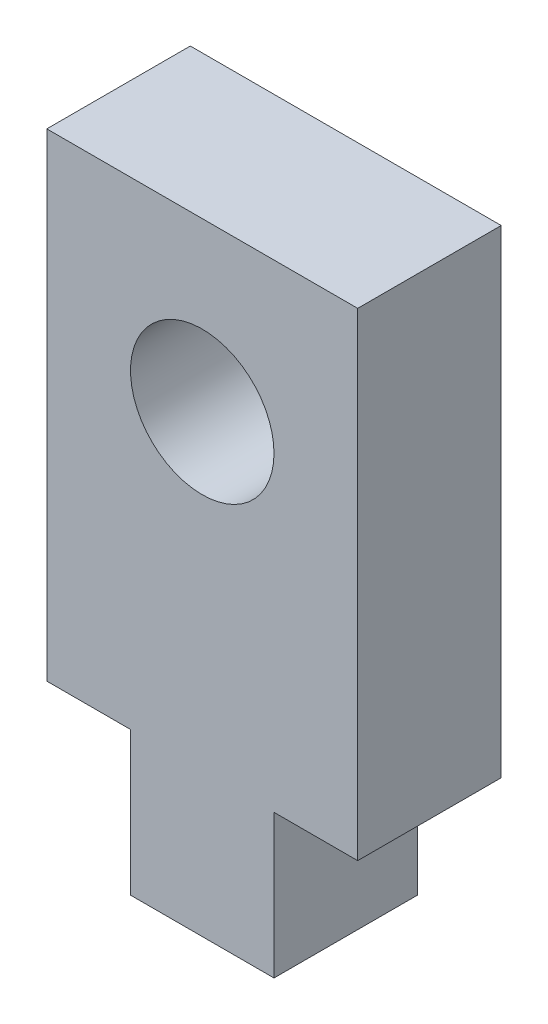
ISO-10303-21;
HEADER;
FILE_DESCRIPTION(('STEP AP214'),'2;1');
FILE_NAME('part.step','',(''),(''),'','','');
FILE_SCHEMA(('AUTOMOTIVE_DESIGN { 1 0 10303 214 1 1 1 1 }'));
ENDSEC;
DATA;
#1=APPLICATION_CONTEXT('core data for automotive mechanical design processes');
#2=APPLICATION_PROTOCOL_DEFINITION('international standard','automotive_design',2000,#1);
#3=PRODUCT_CONTEXT('',#1,'mechanical');
#4=PRODUCT('Part','Part','',(#3));
#5=PRODUCT_RELATED_PRODUCT_CATEGORY('part','',(#4));
#6=PRODUCT_DEFINITION_FORMATION('','',#4);
#7=PRODUCT_DEFINITION_CONTEXT('part definition',#1,'design');
#8=PRODUCT_DEFINITION('design','',#6,#7);
#9=PRODUCT_DEFINITION_SHAPE('','',#8);
#10=(LENGTH_UNIT() NAMED_UNIT(*) SI_UNIT(.MILLI.,.METRE.));
#11=(NAMED_UNIT(*) PLANE_ANGLE_UNIT() SI_UNIT($,.RADIAN.));
#12=(NAMED_UNIT(*) SI_UNIT($,.STERADIAN.) SOLID_ANGLE_UNIT());
#13=UNCERTAINTY_MEASURE_WITH_UNIT(LENGTH_MEASURE(1.E-05),#10,'distance_accuracy_value','');
#14=(GEOMETRIC_REPRESENTATION_CONTEXT(3) GLOBAL_UNCERTAINTY_ASSIGNED_CONTEXT((#13)) GLOBAL_UNIT_ASSIGNED_CONTEXT((#10,
#11,#12)) REPRESENTATION_CONTEXT('',''));
#15=CARTESIAN_POINT('',(0.,0.,0.));
#16=DIRECTION('',(0.,0.,1.));
#17=DIRECTION('',(1.,0.,0.));
#18=AXIS2_PLACEMENT_3D('',#15,#16,#17);
#19=CARTESIAN_POINT('',(0.,0.,3.));
#20=DIRECTION('',(0.,0.,1.));
#21=DIRECTION('',(1.,0.,0.));
#22=AXIS2_PLACEMENT_3D('',#19,#20,#21);
#23=PLANE('',#22);
#24=DIRECTION('',(1.,0.,0.));
#25=VECTOR('',#24,1.);
#26=CARTESIAN_POINT('',(-3.25,-5.,3.));
#27=LINE('',#26,#25);
#28=CARTESIAN_POINT('',(-3.25,-5.,3.));
#29=VERTEX_POINT('',#28);
#30=CARTESIAN_POINT('',(-1.5,-5.,3.));
#31=VERTEX_POINT('',#30);
#32=EDGE_CURVE('E168',#29,#31,#27,.T.);
#33=ORIENTED_EDGE('',*,*,#32,.T.);
#34=DIRECTION('',(0.,-1.,0.));
#35=VECTOR('',#34,1.);
#36=CARTESIAN_POINT('',(-1.5,-8.,3.));
#37=LINE('',#36,#35);
#38=CARTESIAN_POINT('',(-1.5,-8.,3.));
#39=VERTEX_POINT('',#38);
#40=EDGE_CURVE('E104',#31,#39,#37,.T.);
#41=ORIENTED_EDGE('',*,*,#40,.T.);
#42=DIRECTION('',(1.,0.,0.));
#43=VECTOR('',#42,1.);
#44=CARTESIAN_POINT('',(-1.5,-8.,3.));
#45=LINE('',#44,#43);
#46=CARTESIAN_POINT('',(1.5,-8.,3.));
#47=VERTEX_POINT('',#46);
#48=EDGE_CURVE('E189',#39,#47,#45,.T.);
#49=ORIENTED_EDGE('',*,*,#48,.T.);
#50=DIRECTION('',(0.,1.,0.));
#51=VECTOR('',#50,1.);
#52=CARTESIAN_POINT('',(1.5,-8.,3.));
#53=LINE('',#52,#51);
#54=CARTESIAN_POINT('',(1.5,-5.,3.));
#55=VERTEX_POINT('',#54);
#56=EDGE_CURVE('E203',#47,#55,#53,.T.);
#57=ORIENTED_EDGE('',*,*,#56,.T.);
#58=DIRECTION('',(1.,0.,0.));
#59=VECTOR('',#58,1.);
#60=CARTESIAN_POINT('',(1.5,-5.,3.));
#61=LINE('',#60,#59);
#62=CARTESIAN_POINT('',(3.25,-5.,3.));
#63=VERTEX_POINT('',#62);
#64=EDGE_CURVE('E123',#55,#63,#61,.T.);
#65=ORIENTED_EDGE('',*,*,#64,.T.);
#66=DIRECTION('',(0.,1.,0.));
#67=VECTOR('',#66,1.);
#68=CARTESIAN_POINT('',(3.25,-5.,3.));
#69=LINE('',#68,#67);
#70=CARTESIAN_POINT('',(3.25,5.,3.));
#71=VERTEX_POINT('',#70);
#72=EDGE_CURVE('E117',#63,#71,#69,.T.);
#73=ORIENTED_EDGE('',*,*,#72,.T.);
#74=DIRECTION('',(-1.,0.,0.));
#75=VECTOR('',#74,1.);
#76=CARTESIAN_POINT('',(-3.25,5.,3.));
#77=LINE('',#76,#75);
#78=CARTESIAN_POINT('',(-3.25,5.,3.));
#79=VERTEX_POINT('',#78);
#80=EDGE_CURVE('E121',#71,#79,#77,.T.);
#81=ORIENTED_EDGE('',*,*,#80,.T.);
#82=DIRECTION('',(0.,-1.,0.));
#83=VECTOR('',#82,1.);
#84=CARTESIAN_POINT('',(-3.25,-5.,3.));
#85=LINE('',#84,#83);
#86=EDGE_CURVE('E61',#79,#29,#85,.T.);
#87=ORIENTED_EDGE('',*,*,#86,.T.);
#88=EDGE_LOOP('',(#33,#41,#49,#57,#65,#73,#81,#87));
#89=FACE_BOUND('',#88,.T.);
#90=CARTESIAN_POINT('',(0.,1.5,3.));
#91=DIRECTION('',(0.,0.,1.));
#92=DIRECTION('',(1.,0.,0.));
#93=AXIS2_PLACEMENT_3D('',#90,#91,#92);
#94=CIRCLE('',#93,1.5);
#95=CARTESIAN_POINT('',(1.5,1.5,3.));
#96=VERTEX_POINT('',#95);
#97=EDGE_CURVE('E150',#96,#96,#94,.T.);
#98=ORIENTED_EDGE('',*,*,#97,.F.);
#99=EDGE_LOOP('',(#98));
#100=FACE_BOUND('',#99,.T.);
#101=ADVANCED_FACE('F43',(#89,#100),#23,.T.);
#102=CARTESIAN_POINT('',(0.,0.,0.));
#103=DIRECTION('',(0.,0.,1.));
#104=DIRECTION('',(1.,0.,0.));
#105=AXIS2_PLACEMENT_3D('',#102,#103,#104);
#106=PLANE('',#105);
#107=DIRECTION('',(1.,0.,0.));
#108=VECTOR('',#107,1.);
#109=CARTESIAN_POINT('',(-3.25,-5.,0.));
#110=LINE('',#109,#108);
#111=CARTESIAN_POINT('',(-3.25,-5.,0.));
#112=VERTEX_POINT('',#111);
#113=CARTESIAN_POINT('',(-1.5,-5.,0.));
#114=VERTEX_POINT('',#113);
#115=EDGE_CURVE('E145',#112,#114,#110,.T.);
#116=ORIENTED_EDGE('',*,*,#115,.F.);
#117=DIRECTION('',(0.,-1.,0.));
#118=VECTOR('',#117,1.);
#119=CARTESIAN_POINT('',(-3.25,-5.,0.));
#120=LINE('',#119,#118);
#121=CARTESIAN_POINT('',(-3.25,5.,0.));
#122=VERTEX_POINT('',#121);
#123=EDGE_CURVE('E96',#122,#112,#120,.T.);
#124=ORIENTED_EDGE('',*,*,#123,.F.);
#125=DIRECTION('',(-1.,0.,0.));
#126=VECTOR('',#125,1.);
#127=CARTESIAN_POINT('',(-3.25,5.,0.));
#128=LINE('',#127,#126);
#129=CARTESIAN_POINT('',(3.25,5.,0.));
#130=VERTEX_POINT('',#129);
#131=EDGE_CURVE('E90',#130,#122,#128,.T.);
#132=ORIENTED_EDGE('',*,*,#131,.F.);
#133=DIRECTION('',(0.,1.,0.));
#134=VECTOR('',#133,1.);
#135=CARTESIAN_POINT('',(3.25,-5.,0.));
#136=LINE('',#135,#134);
#137=CARTESIAN_POINT('',(3.25,-5.,0.));
#138=VERTEX_POINT('',#137);
#139=EDGE_CURVE('E132',#138,#130,#136,.T.);
#140=ORIENTED_EDGE('',*,*,#139,.F.);
#141=DIRECTION('',(1.,0.,0.));
#142=VECTOR('',#141,1.);
#143=CARTESIAN_POINT('',(1.5,-5.,0.));
#144=LINE('',#143,#142);
#145=CARTESIAN_POINT('',(1.5,-5.,0.));
#146=VERTEX_POINT('',#145);
#147=EDGE_CURVE('E159',#146,#138,#144,.T.);
#148=ORIENTED_EDGE('',*,*,#147,.F.);
#149=DIRECTION('',(0.,1.,0.));
#150=VECTOR('',#149,1.);
#151=CARTESIAN_POINT('',(1.5,-8.,0.));
#152=LINE('',#151,#150);
#153=CARTESIAN_POINT('',(1.5,-8.,0.));
#154=VERTEX_POINT('',#153);
#155=EDGE_CURVE('E156',#154,#146,#152,.T.);
#156=ORIENTED_EDGE('',*,*,#155,.F.);
#157=DIRECTION('',(1.,0.,0.));
#158=VECTOR('',#157,1.);
#159=CARTESIAN_POINT('',(-1.5,-8.,0.));
#160=LINE('',#159,#158);
#161=CARTESIAN_POINT('',(-1.5,-8.,0.));
#162=VERTEX_POINT('',#161);
#163=EDGE_CURVE('E153',#162,#154,#160,.T.);
#164=ORIENTED_EDGE('',*,*,#163,.F.);
#165=DIRECTION('',(0.,-1.,0.));
#166=VECTOR('',#165,1.);
#167=CARTESIAN_POINT('',(-1.5,-8.,0.));
#168=LINE('',#167,#166);
#169=EDGE_CURVE('E149',#114,#162,#168,.T.);
#170=ORIENTED_EDGE('',*,*,#169,.F.);
#171=EDGE_LOOP('',(#116,#124,#132,#140,#148,#156,#164,#170));
#172=FACE_BOUND('',#171,.T.);
#173=CARTESIAN_POINT('',(0.,1.5,0.));
#174=DIRECTION('',(0.,0.,1.));
#175=DIRECTION('',(1.,0.,0.));
#176=AXIS2_PLACEMENT_3D('',#173,#174,#175);
#177=CIRCLE('',#176,1.5);
#178=CARTESIAN_POINT('',(1.5,1.5,0.));
#179=VERTEX_POINT('',#178);
#180=EDGE_CURVE('E213',#179,#179,#177,.T.);
#181=ORIENTED_EDGE('',*,*,#180,.T.);
#182=EDGE_LOOP('',(#181));
#183=FACE_BOUND('',#182,.T.);
#184=ADVANCED_FACE('F193',(#172,#183),#106,.F.);
#185=CARTESIAN_POINT('',(-3.25,-5.,3.));
#186=DIRECTION('',(0.,1.,0.));
#187=DIRECTION('',(0.,0.,1.));
#188=AXIS2_PLACEMENT_3D('',#185,#186,#187);
#189=PLANE('',#188);
#190=ORIENTED_EDGE('',*,*,#115,.T.);
#191=DIRECTION('',(0.,0.,-1.));
#192=VECTOR('',#191,1.);
#193=CARTESIAN_POINT('',(-1.5,-5.,3.));
#194=LINE('',#193,#192);
#195=EDGE_CURVE('E11',#31,#114,#194,.T.);
#196=ORIENTED_EDGE('',*,*,#195,.F.);
#197=ORIENTED_EDGE('',*,*,#32,.F.);
#198=DIRECTION('',(0.,0.,-1.));
#199=VECTOR('',#198,1.);
#200=CARTESIAN_POINT('',(-3.25,-5.,3.));
#201=LINE('',#200,#199);
#202=EDGE_CURVE('E141',#29,#112,#201,.T.);
#203=ORIENTED_EDGE('',*,*,#202,.T.);
#204=EDGE_LOOP('',(#190,#196,#197,#203));
#205=FACE_BOUND('',#204,.T.);
#206=ADVANCED_FACE('F45',(#205),#189,.F.);
#207=CARTESIAN_POINT('',(-1.5,-8.,3.));
#208=DIRECTION('',(1.,0.,0.));
#209=DIRECTION('',(0.,1.,0.));
#210=AXIS2_PLACEMENT_3D('',#207,#208,#209);
#211=PLANE('',#210);
#212=ORIENTED_EDGE('',*,*,#169,.T.);
#213=DIRECTION('',(0.,0.,-1.));
#214=VECTOR('',#213,1.);
#215=CARTESIAN_POINT('',(-1.5,-8.,3.));
#216=LINE('',#215,#214);
#217=EDGE_CURVE('E53',#39,#162,#216,.T.);
#218=ORIENTED_EDGE('',*,*,#217,.F.);
#219=ORIENTED_EDGE('',*,*,#40,.F.);
#220=ORIENTED_EDGE('',*,*,#195,.T.);
#221=EDGE_LOOP('',(#212,#218,#219,#220));
#222=FACE_BOUND('',#221,.T.);
#223=ADVANCED_FACE('F243',(#222),#211,.F.);
#224=CARTESIAN_POINT('',(-1.5,-8.,3.));
#225=DIRECTION('',(0.,1.,0.));
#226=DIRECTION('',(0.,0.,1.));
#227=AXIS2_PLACEMENT_3D('',#224,#225,#226);
#228=PLANE('',#227);
#229=ORIENTED_EDGE('',*,*,#163,.T.);
#230=DIRECTION('',(0.,0.,-1.));
#231=VECTOR('',#230,1.);
#232=CARTESIAN_POINT('',(1.5,-8.,3.));
#233=LINE('',#232,#231);
#234=EDGE_CURVE('E179',#47,#154,#233,.T.);
#235=ORIENTED_EDGE('',*,*,#234,.F.);
#236=ORIENTED_EDGE('',*,*,#48,.F.);
#237=ORIENTED_EDGE('',*,*,#217,.T.);
#238=EDGE_LOOP('',(#229,#235,#236,#237));
#239=FACE_BOUND('',#238,.T.);
#240=ADVANCED_FACE('F187',(#239),#228,.F.);
#241=CARTESIAN_POINT('',(1.5,-8.,3.));
#242=DIRECTION('',(-1.,0.,0.));
#243=DIRECTION('',(0.,0.,1.));
#244=AXIS2_PLACEMENT_3D('',#241,#242,#243);
#245=PLANE('',#244);
#246=ORIENTED_EDGE('',*,*,#155,.T.);
#247=DIRECTION('',(0.,0.,-1.));
#248=VECTOR('',#247,1.);
#249=CARTESIAN_POINT('',(1.5,-5.,3.));
#250=LINE('',#249,#248);
#251=EDGE_CURVE('E175',#55,#146,#250,.T.);
#252=ORIENTED_EDGE('',*,*,#251,.F.);
#253=ORIENTED_EDGE('',*,*,#56,.F.);
#254=ORIENTED_EDGE('',*,*,#234,.T.);
#255=EDGE_LOOP('',(#246,#252,#253,#254));
#256=FACE_BOUND('',#255,.T.);
#257=ADVANCED_FACE('F198',(#256),#245,.F.);
#258=CARTESIAN_POINT('',(1.5,-5.,3.));
#259=DIRECTION('',(0.,1.,0.));
#260=DIRECTION('',(-1.,0.,0.));
#261=AXIS2_PLACEMENT_3D('',#258,#259,#260);
#262=PLANE('',#261);
#263=ORIENTED_EDGE('',*,*,#147,.T.);
#264=DIRECTION('',(0.,0.,-1.));
#265=VECTOR('',#264,1.);
#266=CARTESIAN_POINT('',(3.25,-5.,3.));
#267=LINE('',#266,#265);
#268=EDGE_CURVE('E134',#63,#138,#267,.T.);
#269=ORIENTED_EDGE('',*,*,#268,.F.);
#270=ORIENTED_EDGE('',*,*,#64,.F.);
#271=ORIENTED_EDGE('',*,*,#251,.T.);
#272=EDGE_LOOP('',(#263,#269,#270,#271));
#273=FACE_BOUND('',#272,.T.);
#274=ADVANCED_FACE('F201',(#273),#262,.F.);
#275=CARTESIAN_POINT('',(3.25,-5.,3.));
#276=DIRECTION('',(-1.,0.,0.));
#277=DIRECTION('',(0.,0.,1.));
#278=AXIS2_PLACEMENT_3D('',#275,#276,#277);
#279=PLANE('',#278);
#280=ORIENTED_EDGE('',*,*,#139,.T.);
#281=DIRECTION('',(0.,0.,-1.));
#282=VECTOR('',#281,1.);
#283=CARTESIAN_POINT('',(3.25,5.,3.));
#284=LINE('',#283,#282);
#285=EDGE_CURVE('E129',#71,#130,#284,.T.);
#286=ORIENTED_EDGE('',*,*,#285,.F.);
#287=ORIENTED_EDGE('',*,*,#72,.F.);
#288=ORIENTED_EDGE('',*,*,#268,.T.);
#289=EDGE_LOOP('',(#280,#286,#287,#288));
#290=FACE_BOUND('',#289,.T.);
#291=ADVANCED_FACE('F130',(#290),#279,.F.);
#292=CARTESIAN_POINT('',(-3.25,5.,3.));
#293=DIRECTION('',(0.,-1.,0.));
#294=DIRECTION('',(0.,0.,-1.));
#295=AXIS2_PLACEMENT_3D('',#292,#293,#294);
#296=PLANE('',#295);
#297=ORIENTED_EDGE('',*,*,#131,.T.);
#298=DIRECTION('',(0.,0.,-1.));
#299=VECTOR('',#298,1.);
#300=CARTESIAN_POINT('',(-3.25,5.,3.));
#301=LINE('',#300,#299);
#302=EDGE_CURVE('E135',#79,#122,#301,.T.);
#303=ORIENTED_EDGE('',*,*,#302,.F.);
#304=ORIENTED_EDGE('',*,*,#80,.F.);
#305=ORIENTED_EDGE('',*,*,#285,.T.);
#306=EDGE_LOOP('',(#297,#303,#304,#305));
#307=FACE_BOUND('',#306,.T.);
#308=ADVANCED_FACE('F137',(#307),#296,.F.);
#309=CARTESIAN_POINT('',(-3.25,-5.,3.));
#310=DIRECTION('',(1.,0.,0.));
#311=DIRECTION('',(0.,0.,-1.));
#312=AXIS2_PLACEMENT_3D('',#309,#310,#311);
#313=PLANE('',#312);
#314=ORIENTED_EDGE('',*,*,#123,.T.);
#315=ORIENTED_EDGE('',*,*,#202,.F.);
#316=ORIENTED_EDGE('',*,*,#86,.F.);
#317=ORIENTED_EDGE('',*,*,#302,.T.);
#318=EDGE_LOOP('',(#314,#315,#316,#317));
#319=FACE_BOUND('',#318,.T.);
#320=ADVANCED_FACE('F231',(#319),#313,.F.);
#321=CARTESIAN_POINT('',(0.,1.5,3.));
#322=DIRECTION('',(0.,0.,-1.));
#323=DIRECTION('',(-1.,0.,0.));
#324=AXIS2_PLACEMENT_3D('',#321,#322,#323);
#325=CYLINDRICAL_SURFACE('',#324,1.5);
#326=ORIENTED_EDGE('',*,*,#97,.T.);
#327=EDGE_LOOP('',(#326));
#328=FACE_BOUND('',#327,.T.);
#329=ORIENTED_EDGE('',*,*,#180,.F.);
#330=EDGE_LOOP('',(#329));
#331=FACE_BOUND('',#330,.T.);
#332=ADVANCED_FACE('F221',(#328,#331),#325,.F.);
#333=CLOSED_SHELL('',(#101,#184,#206,#223,#240,#257,#274,#291,#308,#320,#332));
#334=MANIFOLD_SOLID_BREP('B2',#333);
#335=ADVANCED_BREP_SHAPE_REPRESENTATION('',(#18,#334),#14);
#336=SHAPE_DEFINITION_REPRESENTATION(#9,#335);
ENDSEC;
END-ISO-10303-21;
